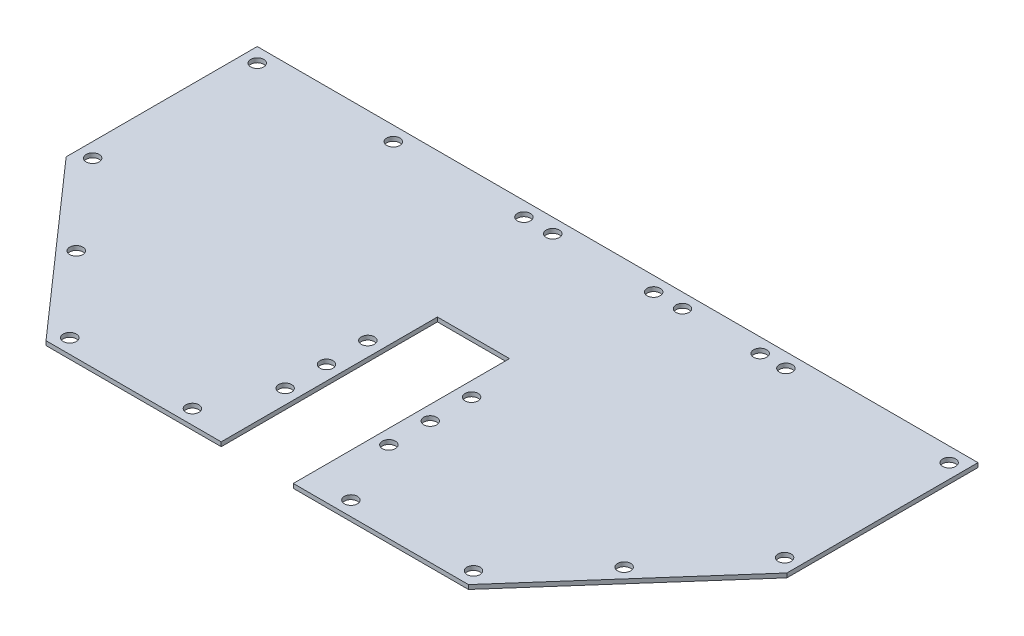
ISO-10303-21;
HEADER;
FILE_DESCRIPTION(('STEP AP214'),'2;1');
FILE_NAME('part.step','',(''),(''),'','','');
FILE_SCHEMA(('AUTOMOTIVE_DESIGN { 1 0 10303 214 1 1 1 1 }'));
ENDSEC;
DATA;
#1=APPLICATION_CONTEXT('core data for automotive mechanical design processes');
#2=APPLICATION_PROTOCOL_DEFINITION('international standard','automotive_design',2000,#1);
#3=PRODUCT_CONTEXT('',#1,'mechanical');
#4=PRODUCT('Part','Part','',(#3));
#5=PRODUCT_RELATED_PRODUCT_CATEGORY('part','',(#4));
#6=PRODUCT_DEFINITION_FORMATION('','',#4);
#7=PRODUCT_DEFINITION_CONTEXT('part definition',#1,'design');
#8=PRODUCT_DEFINITION('design','',#6,#7);
#9=PRODUCT_DEFINITION_SHAPE('','',#8);
#10=(LENGTH_UNIT() NAMED_UNIT(*) SI_UNIT(.MILLI.,.METRE.));
#11=(NAMED_UNIT(*) PLANE_ANGLE_UNIT() SI_UNIT($,.RADIAN.));
#12=(NAMED_UNIT(*) SI_UNIT($,.STERADIAN.) SOLID_ANGLE_UNIT());
#13=UNCERTAINTY_MEASURE_WITH_UNIT(LENGTH_MEASURE(1.E-05),#10,'distance_accuracy_value','');
#14=(GEOMETRIC_REPRESENTATION_CONTEXT(3) GLOBAL_UNCERTAINTY_ASSIGNED_CONTEXT((#13)) GLOBAL_UNIT_ASSIGNED_CONTEXT((#10,
#11,#12)) REPRESENTATION_CONTEXT('',''));
#15=CARTESIAN_POINT('',(0.,0.,0.));
#16=DIRECTION('',(0.,0.,1.));
#17=DIRECTION('',(1.,0.,0.));
#18=AXIS2_PLACEMENT_3D('',#15,#16,#17);
#19=CARTESIAN_POINT('',(139.7,1.5,0.));
#20=DIRECTION('',(-1.,0.,0.));
#21=DIRECTION('',(0.,0.,1.));
#22=AXIS2_PLACEMENT_3D('',#19,#20,#21);
#23=PLANE('',#22);
#24=DIRECTION('',(0.,0.,-1.));
#25=VECTOR('',#24,1.);
#26=CARTESIAN_POINT('',(139.7,0.,0.));
#27=LINE('',#26,#25);
#28=CARTESIAN_POINT('',(139.7,0.,126.995854643066));
#29=VERTEX_POINT('',#28);
#30=CARTESIAN_POINT('',(139.7,0.,50.8));
#31=VERTEX_POINT('',#30);
#32=EDGE_CURVE('E174',#29,#31,#27,.T.);
#33=ORIENTED_EDGE('',*,*,#32,.F.);
#34=DIRECTION('',(0.,-1.,0.));
#35=VECTOR('',#34,1.);
#36=CARTESIAN_POINT('',(139.7,1.5,126.995854643066));
#37=LINE('',#36,#35);
#38=CARTESIAN_POINT('',(139.7,1.5,126.995854643066));
#39=VERTEX_POINT('',#38);
#40=EDGE_CURVE('E11',#39,#29,#37,.T.);
#41=ORIENTED_EDGE('',*,*,#40,.F.);
#42=DIRECTION('',(0.,0.,-1.));
#43=VECTOR('',#42,1.);
#44=CARTESIAN_POINT('',(139.7,1.5,0.));
#45=LINE('',#44,#43);
#46=CARTESIAN_POINT('',(139.7,1.5,50.8));
#47=VERTEX_POINT('',#46);
#48=EDGE_CURVE('E645',#39,#47,#45,.T.);
#49=ORIENTED_EDGE('',*,*,#48,.T.);
#50=DIRECTION('',(0.,-1.,0.));
#51=VECTOR('',#50,1.);
#52=CARTESIAN_POINT('',(139.7,1.5,50.8));
#53=LINE('',#52,#51);
#54=EDGE_CURVE('E97',#47,#31,#53,.T.);
#55=ORIENTED_EDGE('',*,*,#54,.T.);
#56=EDGE_LOOP('',(#33,#41,#49,#55));
#57=FACE_BOUND('',#56,.T.);
#58=ADVANCED_FACE('F40',(#57),#23,.T.);
#59=CARTESIAN_POINT('',(0.,1.5,126.995854643066));
#60=DIRECTION('',(0.,0.,-1.));
#61=DIRECTION('',(-1.,0.,0.));
#62=AXIS2_PLACEMENT_3D('',#59,#60,#61);
#63=PLANE('',#62);
#64=DIRECTION('',(1.,0.,0.));
#65=VECTOR('',#64,1.);
#66=CARTESIAN_POINT('',(0.,0.,126.995854643066));
#67=LINE('',#66,#65);
#68=CARTESIAN_POINT('',(201.436197447224,0.,126.995854643066));
#69=VERTEX_POINT('',#68);
#70=EDGE_CURVE('E172',#29,#69,#67,.T.);
#71=ORIENTED_EDGE('',*,*,#70,.T.);
#72=DIRECTION('',(0.,-1.,0.));
#73=VECTOR('',#72,1.);
#74=CARTESIAN_POINT('',(201.436197447224,1.5,126.995854643066));
#75=LINE('',#74,#73);
#76=CARTESIAN_POINT('',(201.436197447224,1.5,126.995854643066));
#77=VERTEX_POINT('',#76);
#78=EDGE_CURVE('E49',#77,#69,#75,.T.);
#79=ORIENTED_EDGE('',*,*,#78,.F.);
#80=DIRECTION('',(1.,0.,0.));
#81=VECTOR('',#80,1.);
#82=CARTESIAN_POINT('',(0.,1.5,126.995854643066));
#83=LINE('',#82,#81);
#84=EDGE_CURVE('E641',#39,#77,#83,.T.);
#85=ORIENTED_EDGE('',*,*,#84,.F.);
#86=ORIENTED_EDGE('',*,*,#40,.T.);
#87=EDGE_LOOP('',(#71,#79,#85,#86));
#88=FACE_BOUND('',#87,.T.);
#89=ADVANCED_FACE('F173',(#88),#63,.F.);
#90=CARTESIAN_POINT('',(176.390536682891,1.5,155.420744499473));
#91=DIRECTION('',(0.750297634943516,0.,0.661100188321079));
#92=DIRECTION('',(0.661100188321079,0.,-0.750297634943516));
#93=AXIS2_PLACEMENT_3D('',#90,#91,#92);
#94=PLANE('',#93);
#95=DIRECTION('',(-0.661100188321079,0.,0.750297634943516));
#96=VECTOR('',#95,1.);
#97=CARTESIAN_POINT('',(176.390536682891,0.,155.420744499473));
#98=LINE('',#97,#96);
#99=CARTESIAN_POINT('',(254.,0.,67.34));
#100=VERTEX_POINT('',#99);
#101=EDGE_CURVE('E166',#100,#69,#98,.T.);
#102=ORIENTED_EDGE('',*,*,#101,.F.);
#103=DIRECTION('',(0.,-1.,0.));
#104=VECTOR('',#103,1.);
#105=CARTESIAN_POINT('',(254.,1.5,67.34));
#106=LINE('',#105,#104);
#107=CARTESIAN_POINT('',(254.,1.5,67.34));
#108=VERTEX_POINT('',#107);
#109=EDGE_CURVE('E158',#108,#100,#106,.T.);
#110=ORIENTED_EDGE('',*,*,#109,.F.);
#111=DIRECTION('',(-0.661100188321079,0.,0.750297634943516));
#112=VECTOR('',#111,1.);
#113=CARTESIAN_POINT('',(176.390536682891,1.5,155.420744499473));
#114=LINE('',#113,#112);
#115=EDGE_CURVE('E169',#108,#77,#114,.T.);
#116=ORIENTED_EDGE('',*,*,#115,.T.);
#117=ORIENTED_EDGE('',*,*,#78,.T.);
#118=EDGE_LOOP('',(#102,#110,#116,#117));
#119=FACE_BOUND('',#118,.T.);
#120=ADVANCED_FACE('F164',(#119),#94,.T.);
#121=CARTESIAN_POINT('',(254.,1.5,0.));
#122=DIRECTION('',(1.,0.,0.));
#123=DIRECTION('',(0.,0.,-1.));
#124=AXIS2_PLACEMENT_3D('',#121,#122,#123);
#125=PLANE('',#124);
#126=DIRECTION('',(0.,0.,1.));
#127=VECTOR('',#126,1.);
#128=CARTESIAN_POINT('',(254.,0.,0.));
#129=LINE('',#128,#127);
#130=CARTESIAN_POINT('',(254.,0.,0.));
#131=VERTEX_POINT('',#130);
#132=EDGE_CURVE('E180',#131,#100,#129,.T.);
#133=ORIENTED_EDGE('',*,*,#132,.F.);
#134=DIRECTION('',(0.,-1.,0.));
#135=VECTOR('',#134,1.);
#136=CARTESIAN_POINT('',(254.,1.5,0.));
#137=LINE('',#136,#135);
#138=CARTESIAN_POINT('',(254.,1.5,0.));
#139=VERTEX_POINT('',#138);
#140=EDGE_CURVE('E156',#139,#131,#137,.T.);
#141=ORIENTED_EDGE('',*,*,#140,.F.);
#142=DIRECTION('',(0.,0.,1.));
#143=VECTOR('',#142,1.);
#144=CARTESIAN_POINT('',(254.,1.5,0.));
#145=LINE('',#144,#143);
#146=EDGE_CURVE('E639',#139,#108,#145,.T.);
#147=ORIENTED_EDGE('',*,*,#146,.T.);
#148=ORIENTED_EDGE('',*,*,#109,.T.);
#149=EDGE_LOOP('',(#133,#141,#147,#148));
#150=FACE_BOUND('',#149,.T.);
#151=ADVANCED_FACE('F427',(#150),#125,.T.);
#152=CARTESIAN_POINT('',(0.,1.5,0.));
#153=DIRECTION('',(0.,0.,1.));
#154=DIRECTION('',(1.,0.,0.));
#155=AXIS2_PLACEMENT_3D('',#152,#153,#154);
#156=PLANE('',#155);
#157=DIRECTION('',(-1.,0.,0.));
#158=VECTOR('',#157,1.);
#159=CARTESIAN_POINT('',(0.,0.,0.));
#160=LINE('',#159,#158);
#161=CARTESIAN_POINT('',(0.,0.,0.));
#162=VERTEX_POINT('',#161);
#163=EDGE_CURVE('E182',#131,#162,#160,.T.);
#164=ORIENTED_EDGE('',*,*,#163,.T.);
#165=DIRECTION('',(0.,-1.,0.));
#166=VECTOR('',#165,1.);
#167=CARTESIAN_POINT('',(0.,1.5,0.));
#168=LINE('',#167,#166);
#169=CARTESIAN_POINT('',(0.,1.5,0.));
#170=VERTEX_POINT('',#169);
#171=EDGE_CURVE('E153',#170,#162,#168,.T.);
#172=ORIENTED_EDGE('',*,*,#171,.F.);
#173=DIRECTION('',(-1.,0.,0.));
#174=VECTOR('',#173,1.);
#175=CARTESIAN_POINT('',(0.,1.5,0.));
#176=LINE('',#175,#174);
#177=EDGE_CURVE('E643',#139,#170,#176,.T.);
#178=ORIENTED_EDGE('',*,*,#177,.F.);
#179=ORIENTED_EDGE('',*,*,#140,.T.);
#180=EDGE_LOOP('',(#164,#172,#178,#179));
#181=FACE_BOUND('',#180,.T.);
#182=ADVANCED_FACE('F423',(#181),#156,.F.);
#183=CARTESIAN_POINT('',(0.,1.5,0.));
#184=DIRECTION('',(1.,0.,0.));
#185=DIRECTION('',(0.,0.,-1.));
#186=AXIS2_PLACEMENT_3D('',#183,#184,#185);
#187=PLANE('',#186);
#188=DIRECTION('',(0.,0.,1.));
#189=VECTOR('',#188,1.);
#190=CARTESIAN_POINT('',(0.,0.,0.));
#191=LINE('',#190,#189);
#192=CARTESIAN_POINT('',(0.,0.,67.34));
#193=VERTEX_POINT('',#192);
#194=EDGE_CURVE('E188',#162,#193,#191,.T.);
#195=ORIENTED_EDGE('',*,*,#194,.T.);
#196=DIRECTION('',(0.,-1.,0.));
#197=VECTOR('',#196,1.);
#198=CARTESIAN_POINT('',(0.,1.5,67.34));
#199=LINE('',#198,#197);
#200=CARTESIAN_POINT('',(0.,1.5,67.34));
#201=VERTEX_POINT('',#200);
#202=EDGE_CURVE('E146',#201,#193,#199,.T.);
#203=ORIENTED_EDGE('',*,*,#202,.F.);
#204=DIRECTION('',(0.,0.,1.));
#205=VECTOR('',#204,1.);
#206=CARTESIAN_POINT('',(0.,1.5,0.));
#207=LINE('',#206,#205);
#208=EDGE_CURVE('E650',#170,#201,#207,.T.);
#209=ORIENTED_EDGE('',*,*,#208,.F.);
#210=ORIENTED_EDGE('',*,*,#171,.T.);
#211=EDGE_LOOP('',(#195,#203,#209,#210));
#212=FACE_BOUND('',#211,.T.);
#213=ADVANCED_FACE('F419',(#212),#187,.F.);
#214=CARTESIAN_POINT('',(-33.4015185356888,1.5,29.4264802922528));
#215=DIRECTION('',(0.750344141495339,0.,-0.661047403234914));
#216=DIRECTION('',(-0.661047403234914,0.,-0.750344141495339));
#217=AXIS2_PLACEMENT_3D('',#214,#215,#216);
#218=PLANE('',#217);
#219=DIRECTION('',(0.661047403234914,0.,0.750344141495339));
#220=VECTOR('',#219,1.);
#221=CARTESIAN_POINT('',(-33.4015185356888,0.,29.4264802922528));
#222=LINE('',#221,#220);
#223=CARTESIAN_POINT('',(52.5563479725036,0.,126.995854643066));
#224=VERTEX_POINT('',#223);
#225=EDGE_CURVE('E191',#193,#224,#222,.T.);
#226=ORIENTED_EDGE('',*,*,#225,.T.);
#227=DIRECTION('',(0.,-1.,0.));
#228=VECTOR('',#227,1.);
#229=CARTESIAN_POINT('',(52.5563479725036,1.5,126.995854643066));
#230=LINE('',#229,#228);
#231=CARTESIAN_POINT('',(52.5563479725036,1.5,126.995854643066));
#232=VERTEX_POINT('',#231);
#233=EDGE_CURVE('E144',#232,#224,#230,.T.);
#234=ORIENTED_EDGE('',*,*,#233,.F.);
#235=DIRECTION('',(0.661047403234914,0.,0.750344141495339));
#236=VECTOR('',#235,1.);
#237=CARTESIAN_POINT('',(-33.4015185356888,1.5,29.4264802922528));
#238=LINE('',#237,#236);
#239=EDGE_CURVE('E137',#201,#232,#238,.T.);
#240=ORIENTED_EDGE('',*,*,#239,.F.);
#241=ORIENTED_EDGE('',*,*,#202,.T.);
#242=EDGE_LOOP('',(#226,#234,#240,#241));
#243=FACE_BOUND('',#242,.T.);
#244=ADVANCED_FACE('F416',(#243),#218,.F.);
#245=CARTESIAN_POINT('',(0.,1.5,126.995854643066));
#246=DIRECTION('',(0.,0.,-1.));
#247=DIRECTION('',(-1.,0.,0.));
#248=AXIS2_PLACEMENT_3D('',#245,#246,#247);
#249=PLANE('',#248);
#250=DIRECTION('',(1.,0.,0.));
#251=VECTOR('',#250,1.);
#252=CARTESIAN_POINT('',(0.,0.,126.995854643066));
#253=LINE('',#252,#251);
#254=CARTESIAN_POINT('',(114.3,0.,126.995854643066));
#255=VERTEX_POINT('',#254);
#256=EDGE_CURVE('E143',#224,#255,#253,.T.);
#257=ORIENTED_EDGE('',*,*,#256,.T.);
#258=DIRECTION('',(0.,-1.,0.));
#259=VECTOR('',#258,1.);
#260=CARTESIAN_POINT('',(114.3,1.5,126.995854643066));
#261=LINE('',#260,#259);
#262=CARTESIAN_POINT('',(114.3,1.5,126.995854643066));
#263=VERTEX_POINT('',#262);
#264=EDGE_CURVE('E128',#263,#255,#261,.T.);
#265=ORIENTED_EDGE('',*,*,#264,.F.);
#266=DIRECTION('',(1.,0.,0.));
#267=VECTOR('',#266,1.);
#268=CARTESIAN_POINT('',(0.,1.5,126.995854643066));
#269=LINE('',#268,#267);
#270=EDGE_CURVE('E131',#232,#263,#269,.T.);
#271=ORIENTED_EDGE('',*,*,#270,.F.);
#272=ORIENTED_EDGE('',*,*,#233,.T.);
#273=EDGE_LOOP('',(#257,#265,#271,#272));
#274=FACE_BOUND('',#273,.T.);
#275=ADVANCED_FACE('F142',(#274),#249,.F.);
#276=CARTESIAN_POINT('',(114.3,1.5,0.));
#277=DIRECTION('',(-1.,0.,0.));
#278=DIRECTION('',(0.,0.,1.));
#279=AXIS2_PLACEMENT_3D('',#276,#277,#278);
#280=PLANE('',#279);
#281=DIRECTION('',(0.,0.,-1.));
#282=VECTOR('',#281,1.);
#283=CARTESIAN_POINT('',(114.3,0.,0.));
#284=LINE('',#283,#282);
#285=CARTESIAN_POINT('',(114.3,0.,50.8));
#286=VERTEX_POINT('',#285);
#287=EDGE_CURVE('E195',#255,#286,#284,.T.);
#288=ORIENTED_EDGE('',*,*,#287,.T.);
#289=DIRECTION('',(0.,-1.,0.));
#290=VECTOR('',#289,1.);
#291=CARTESIAN_POINT('',(114.3,1.5,50.8));
#292=LINE('',#291,#290);
#293=CARTESIAN_POINT('',(114.3,1.5,50.8));
#294=VERTEX_POINT('',#293);
#295=EDGE_CURVE('E130',#294,#286,#292,.T.);
#296=ORIENTED_EDGE('',*,*,#295,.F.);
#297=DIRECTION('',(0.,0.,-1.));
#298=VECTOR('',#297,1.);
#299=CARTESIAN_POINT('',(114.3,1.5,0.));
#300=LINE('',#299,#298);
#301=EDGE_CURVE('E123',#263,#294,#300,.T.);
#302=ORIENTED_EDGE('',*,*,#301,.F.);
#303=ORIENTED_EDGE('',*,*,#264,.T.);
#304=EDGE_LOOP('',(#288,#296,#302,#303));
#305=FACE_BOUND('',#304,.T.);
#306=ADVANCED_FACE('F126',(#305),#280,.F.);
#307=CARTESIAN_POINT('',(109.22,1.5,70.2458546430663));
#308=DIRECTION('',(0.,-1.,0.));
#309=DIRECTION('',(0.,0.,-1.));
#310=AXIS2_PLACEMENT_3D('',#307,#308,#309);
#311=CYLINDRICAL_SURFACE('',#310,2.30000000000001);
#312=CARTESIAN_POINT('',(109.22,1.5,70.2458546430663));
#313=DIRECTION('',(0.,1.,0.));
#314=DIRECTION('',(0.,0.,1.));
#315=AXIS2_PLACEMENT_3D('',#312,#313,#314);
#316=CIRCLE('',#315,2.30000000000001);
#317=CARTESIAN_POINT('',(109.22,1.5,72.5458546430663));
#318=VERTEX_POINT('',#317);
#319=EDGE_CURVE('E245',#318,#318,#316,.F.);
#320=ORIENTED_EDGE('',*,*,#319,.F.);
#321=EDGE_LOOP('',(#320));
#322=FACE_BOUND('',#321,.T.);
#323=CARTESIAN_POINT('',(109.22,0.,70.2458546430663));
#324=DIRECTION('',(0.,1.,0.));
#325=DIRECTION('',(0.,0.,1.));
#326=AXIS2_PLACEMENT_3D('',#323,#324,#325);
#327=CIRCLE('',#326,2.30000000000001);
#328=CARTESIAN_POINT('',(109.22,0.,72.5458546430663));
#329=VERTEX_POINT('',#328);
#330=EDGE_CURVE('E237',#329,#329,#327,.F.);
#331=ORIENTED_EDGE('',*,*,#330,.T.);
#332=EDGE_LOOP('',(#331));
#333=FACE_BOUND('',#332,.T.);
#334=ADVANCED_FACE('F353',(#322,#333),#311,.F.);
#335=CARTESIAN_POINT('',(144.78,1.5,83.8158546430663));
#336=DIRECTION('',(0.,-1.,0.));
#337=DIRECTION('',(0.,0.,-1.));
#338=AXIS2_PLACEMENT_3D('',#335,#336,#337);
#339=CYLINDRICAL_SURFACE('',#338,2.30000000000001);
#340=CARTESIAN_POINT('',(144.78,1.5,83.8158546430663));
#341=DIRECTION('',(0.,1.,0.));
#342=DIRECTION('',(0.,0.,1.));
#343=AXIS2_PLACEMENT_3D('',#340,#341,#342);
#344=CIRCLE('',#343,2.30000000000001);
#345=CARTESIAN_POINT('',(144.78,1.5,86.1158546430663));
#346=VERTEX_POINT('',#345);
#347=EDGE_CURVE('E250',#346,#346,#344,.F.);
#348=ORIENTED_EDGE('',*,*,#347,.F.);
#349=EDGE_LOOP('',(#348));
#350=FACE_BOUND('',#349,.T.);
#351=CARTESIAN_POINT('',(144.78,0.,83.8158546430663));
#352=DIRECTION('',(0.,1.,0.));
#353=DIRECTION('',(0.,0.,1.));
#354=AXIS2_PLACEMENT_3D('',#351,#352,#353);
#355=CIRCLE('',#354,2.30000000000001);
#356=CARTESIAN_POINT('',(144.78,0.,86.1158546430663));
#357=VERTEX_POINT('',#356);
#358=EDGE_CURVE('E234',#357,#357,#355,.F.);
#359=ORIENTED_EDGE('',*,*,#358,.T.);
#360=EDGE_LOOP('',(#359));
#361=FACE_BOUND('',#360,.T.);
#362=ADVANCED_FACE('F356',(#350,#361),#339,.F.);
#363=CARTESIAN_POINT('',(223.528114704509,1.5,94.2390748809774));
#364=DIRECTION('',(0.,-1.,0.));
#365=DIRECTION('',(0.,0.,-1.));
#366=AXIS2_PLACEMENT_3D('',#363,#364,#365);
#367=CYLINDRICAL_SURFACE('',#366,2.30000000000001);
#368=CARTESIAN_POINT('',(223.528114704509,1.5,94.2390748809774));
#369=DIRECTION('',(0.,1.,0.));
#370=DIRECTION('',(0.,0.,1.));
#371=AXIS2_PLACEMENT_3D('',#368,#369,#370);
#372=CIRCLE('',#371,2.30000000000001);
#373=CARTESIAN_POINT('',(223.528114704509,1.5,96.5390748809774));
#374=VERTEX_POINT('',#373);
#375=EDGE_CURVE('E687',#374,#374,#372,.F.);
#376=ORIENTED_EDGE('',*,*,#375,.F.);
#377=EDGE_LOOP('',(#376));
#378=FACE_BOUND('',#377,.T.);
#379=CARTESIAN_POINT('',(223.528114704509,0.,94.2390748809774));
#380=DIRECTION('',(0.,1.,0.));
#381=DIRECTION('',(0.,0.,1.));
#382=AXIS2_PLACEMENT_3D('',#379,#380,#381);
#383=CIRCLE('',#382,2.30000000000001);
#384=CARTESIAN_POINT('',(223.528114704509,0.,96.5390748809774));
#385=VERTEX_POINT('',#384);
#386=EDGE_CURVE('E231',#385,#385,#383,.F.);
#387=ORIENTED_EDGE('',*,*,#386,.T.);
#388=EDGE_LOOP('',(#387));
#389=FACE_BOUND('',#388,.T.);
#390=ADVANCED_FACE('F360',(#378,#389),#367,.F.);
#391=CARTESIAN_POINT('',(154.94,1.5,5.08000000000003));
#392=DIRECTION('',(0.,-1.,0.));
#393=DIRECTION('',(0.,0.,-1.));
#394=AXIS2_PLACEMENT_3D('',#391,#392,#393);
#395=CYLINDRICAL_SURFACE('',#394,2.30000000000001);
#396=CARTESIAN_POINT('',(154.94,1.5,5.08000000000003));
#397=DIRECTION('',(0.,1.,0.));
#398=DIRECTION('',(0.,0.,1.));
#399=AXIS2_PLACEMENT_3D('',#396,#397,#398);
#400=CIRCLE('',#399,2.30000000000001);
#401=CARTESIAN_POINT('',(154.94,1.5,7.38000000000003));
#402=VERTEX_POINT('',#401);
#403=EDGE_CURVE('E684',#402,#402,#400,.F.);
#404=ORIENTED_EDGE('',*,*,#403,.F.);
#405=EDGE_LOOP('',(#404));
#406=FACE_BOUND('',#405,.T.);
#407=CARTESIAN_POINT('',(154.94,0.,5.08000000000003));
#408=DIRECTION('',(0.,1.,0.));
#409=DIRECTION('',(0.,0.,1.));
#410=AXIS2_PLACEMENT_3D('',#407,#408,#409);
#411=CIRCLE('',#410,2.30000000000001);
#412=CARTESIAN_POINT('',(154.94,0.,7.38000000000003));
#413=VERTEX_POINT('',#412);
#414=EDGE_CURVE('E228',#413,#413,#411,.F.);
#415=ORIENTED_EDGE('',*,*,#414,.T.);
#416=EDGE_LOOP('',(#415));
#417=FACE_BOUND('',#416,.T.);
#418=ADVANCED_FACE('F364',(#406,#417),#395,.F.);
#419=CARTESIAN_POINT('',(109.22,1.5,5.08000000000003));
#420=DIRECTION('',(0.,-1.,0.));
#421=DIRECTION('',(0.,0.,-1.));
#422=AXIS2_PLACEMENT_3D('',#419,#420,#421);
#423=CYLINDRICAL_SURFACE('',#422,2.29999999999999);
#424=CARTESIAN_POINT('',(109.22,1.5,5.08000000000003));
#425=DIRECTION('',(0.,1.,0.));
#426=DIRECTION('',(0.,0.,1.));
#427=AXIS2_PLACEMENT_3D('',#424,#425,#426);
#428=CIRCLE('',#427,2.29999999999999);
#429=CARTESIAN_POINT('',(109.22,1.5,7.38000000000002));
#430=VERTEX_POINT('',#429);
#431=EDGE_CURVE('E681',#430,#430,#428,.T.);
#432=ORIENTED_EDGE('',*,*,#431,.T.);
#433=EDGE_LOOP('',(#432));
#434=FACE_BOUND('',#433,.T.);
#435=CARTESIAN_POINT('',(109.22,0.,5.08000000000003));
#436=DIRECTION('',(0.,1.,0.));
#437=DIRECTION('',(0.,0.,1.));
#438=AXIS2_PLACEMENT_3D('',#435,#436,#437);
#439=CIRCLE('',#438,2.29999999999999);
#440=CARTESIAN_POINT('',(109.22,0.,7.38000000000002));
#441=VERTEX_POINT('',#440);
#442=EDGE_CURVE('E225',#441,#441,#439,.T.);
#443=ORIENTED_EDGE('',*,*,#442,.F.);
#444=EDGE_LOOP('',(#443));
#445=FACE_BOUND('',#444,.T.);
#446=ADVANCED_FACE('F368',(#434,#445),#423,.F.);
#447=CARTESIAN_POINT('',(154.926197447224,1.5,121.915854643066));
#448=DIRECTION('',(0.,-1.,0.));
#449=DIRECTION('',(0.,0.,-1.));
#450=AXIS2_PLACEMENT_3D('',#447,#448,#449);
#451=CYLINDRICAL_SURFACE('',#450,2.30000000000001);
#452=CARTESIAN_POINT('',(154.926197447224,1.5,121.915854643066));
#453=DIRECTION('',(0.,1.,0.));
#454=DIRECTION('',(0.,0.,1.));
#455=AXIS2_PLACEMENT_3D('',#452,#453,#454);
#456=CIRCLE('',#455,2.30000000000001);
#457=CARTESIAN_POINT('',(154.926197447224,1.5,124.215854643066));
#458=VERTEX_POINT('',#457);
#459=EDGE_CURVE('E678',#458,#458,#456,.F.);
#460=ORIENTED_EDGE('',*,*,#459,.F.);
#461=EDGE_LOOP('',(#460));
#462=FACE_BOUND('',#461,.T.);
#463=CARTESIAN_POINT('',(154.926197447224,0.,121.915854643066));
#464=DIRECTION('',(0.,1.,0.));
#465=DIRECTION('',(0.,0.,1.));
#466=AXIS2_PLACEMENT_3D('',#463,#464,#465);
#467=CIRCLE('',#466,2.30000000000001);
#468=CARTESIAN_POINT('',(154.926197447224,0.,124.215854643066));
#469=VERTEX_POINT('',#468);
#470=EDGE_CURVE('E222',#469,#469,#467,.F.);
#471=ORIENTED_EDGE('',*,*,#470,.T.);
#472=EDGE_LOOP('',(#471));
#473=FACE_BOUND('',#472,.T.);
#474=ADVANCED_FACE('F372',(#462,#473),#451,.F.);
#475=CARTESIAN_POINT('',(248.92,1.5,63.0864143021339));
#476=DIRECTION('',(0.,-1.,0.));
#477=DIRECTION('',(0.,0.,-1.));
#478=AXIS2_PLACEMENT_3D('',#475,#476,#477);
#479=CYLINDRICAL_SURFACE('',#478,2.30000000000001);
#480=CARTESIAN_POINT('',(248.92,1.5,63.0864143021339));
#481=DIRECTION('',(0.,1.,0.));
#482=DIRECTION('',(0.,0.,1.));
#483=AXIS2_PLACEMENT_3D('',#480,#481,#482);
#484=CIRCLE('',#483,2.30000000000001);
#485=CARTESIAN_POINT('',(248.92,1.5,65.3864143021339));
#486=VERTEX_POINT('',#485);
#487=EDGE_CURVE('E675',#486,#486,#484,.F.);
#488=ORIENTED_EDGE('',*,*,#487,.F.);
#489=EDGE_LOOP('',(#488));
#490=FACE_BOUND('',#489,.T.);
#491=CARTESIAN_POINT('',(248.92,0.,63.0864143021339));
#492=DIRECTION('',(0.,1.,0.));
#493=DIRECTION('',(0.,0.,1.));
#494=AXIS2_PLACEMENT_3D('',#491,#492,#493);
#495=CIRCLE('',#494,2.30000000000001);
#496=CARTESIAN_POINT('',(248.92,0.,65.3864143021339));
#497=VERTEX_POINT('',#496);
#498=EDGE_CURVE('E219',#497,#497,#495,.F.);
#499=ORIENTED_EDGE('',*,*,#498,.T.);
#500=EDGE_LOOP('',(#499));
#501=FACE_BOUND('',#500,.T.);
#502=ADVANCED_FACE('F376',(#490,#501),#479,.F.);
#503=CARTESIAN_POINT('',(182.3,1.5,5.08000000000003));
#504=DIRECTION('',(0.,-1.,0.));
#505=DIRECTION('',(0.,0.,-1.));
#506=AXIS2_PLACEMENT_3D('',#503,#504,#505);
#507=CYLINDRICAL_SURFACE('',#506,2.30000000000001);
#508=CARTESIAN_POINT('',(182.3,1.5,5.08000000000003));
#509=DIRECTION('',(0.,1.,0.));
#510=DIRECTION('',(0.,0.,1.));
#511=AXIS2_PLACEMENT_3D('',#508,#509,#510);
#512=CIRCLE('',#511,2.30000000000001);
#513=CARTESIAN_POINT('',(182.3,1.5,7.38000000000003));
#514=VERTEX_POINT('',#513);
#515=EDGE_CURVE('E672',#514,#514,#512,.F.);
#516=ORIENTED_EDGE('',*,*,#515,.F.);
#517=EDGE_LOOP('',(#516));
#518=FACE_BOUND('',#517,.T.);
#519=CARTESIAN_POINT('',(182.3,0.,5.08000000000003));
#520=DIRECTION('',(0.,1.,0.));
#521=DIRECTION('',(0.,0.,1.));
#522=AXIS2_PLACEMENT_3D('',#519,#520,#521);
#523=CIRCLE('',#522,2.30000000000001);
#524=CARTESIAN_POINT('',(182.3,0.,7.38000000000003));
#525=VERTEX_POINT('',#524);
#526=EDGE_CURVE('E216',#525,#525,#523,.F.);
#527=ORIENTED_EDGE('',*,*,#526,.T.);
#528=EDGE_LOOP('',(#527));
#529=FACE_BOUND('',#528,.T.);
#530=ADVANCED_FACE('F380',(#518,#529),#507,.F.);
#531=CARTESIAN_POINT('',(55.8561974472237,1.5,121.915854643066));
#532=DIRECTION('',(0.,-1.,0.));
#533=DIRECTION('',(0.,0.,-1.));
#534=AXIS2_PLACEMENT_3D('',#531,#532,#533);
#535=CYLINDRICAL_SURFACE('',#534,2.30000000000001);
#536=CARTESIAN_POINT('',(55.8561974472237,1.5,121.915854643066));
#537=DIRECTION('',(0.,1.,0.));
#538=DIRECTION('',(0.,0.,1.));
#539=AXIS2_PLACEMENT_3D('',#536,#537,#538);
#540=CIRCLE('',#539,2.30000000000001);
#541=CARTESIAN_POINT('',(55.8561974472237,1.5,124.215854643066));
#542=VERTEX_POINT('',#541);
#543=EDGE_CURVE('E669',#542,#542,#540,.T.);
#544=ORIENTED_EDGE('',*,*,#543,.T.);
#545=EDGE_LOOP('',(#544));
#546=FACE_BOUND('',#545,.T.);
#547=CARTESIAN_POINT('',(55.8561974472237,0.,121.915854643066));
#548=DIRECTION('',(0.,1.,0.));
#549=DIRECTION('',(0.,0.,1.));
#550=AXIS2_PLACEMENT_3D('',#547,#548,#549);
#551=CIRCLE('',#550,2.30000000000001);
#552=CARTESIAN_POINT('',(55.8561974472237,0.,124.215854643066));
#553=VERTEX_POINT('',#552);
#554=EDGE_CURVE('E213',#553,#553,#551,.T.);
#555=ORIENTED_EDGE('',*,*,#554,.F.);
#556=EDGE_LOOP('',(#555));
#557=FACE_BOUND('',#556,.T.);
#558=ADVANCED_FACE('F384',(#546,#557),#535,.F.);
#559=CARTESIAN_POINT('',(99.0661974472237,1.5,121.915854643066));
#560=DIRECTION('',(0.,-1.,0.));
#561=DIRECTION('',(0.,0.,-1.));
#562=AXIS2_PLACEMENT_3D('',#559,#560,#561);
#563=CYLINDRICAL_SURFACE('',#562,2.29999999999999);
#564=CARTESIAN_POINT('',(99.0661974472237,1.5,121.915854643066));
#565=DIRECTION('',(0.,1.,0.));
#566=DIRECTION('',(0.,0.,1.));
#567=AXIS2_PLACEMENT_3D('',#564,#565,#566);
#568=CIRCLE('',#567,2.29999999999999);
#569=CARTESIAN_POINT('',(99.0661974472237,1.5,124.215854643066));
#570=VERTEX_POINT('',#569);
#571=EDGE_CURVE('E666',#570,#570,#568,.T.);
#572=ORIENTED_EDGE('',*,*,#571,.T.);
#573=EDGE_LOOP('',(#572));
#574=FACE_BOUND('',#573,.T.);
#575=CARTESIAN_POINT('',(99.0661974472237,0.,121.915854643066));
#576=DIRECTION('',(0.,1.,0.));
#577=DIRECTION('',(0.,0.,1.));
#578=AXIS2_PLACEMENT_3D('',#575,#576,#577);
#579=CIRCLE('',#578,2.29999999999999);
#580=CARTESIAN_POINT('',(99.0661974472237,0.,124.215854643066));
#581=VERTEX_POINT('',#580);
#582=EDGE_CURVE('E210',#581,#581,#579,.T.);
#583=ORIENTED_EDGE('',*,*,#582,.F.);
#584=EDGE_LOOP('',(#583));
#585=FACE_BOUND('',#584,.T.);
#586=ADVANCED_FACE('F388',(#574,#585),#563,.F.);
#587=CARTESIAN_POINT('',(5.08,1.5,63.08));
#588=DIRECTION('',(0.,-1.,0.));
#589=DIRECTION('',(0.,0.,-1.));
#590=AXIS2_PLACEMENT_3D('',#587,#588,#589);
#591=CYLINDRICAL_SURFACE('',#590,2.3);
#592=CARTESIAN_POINT('',(5.08,1.5,63.08));
#593=DIRECTION('',(0.,1.,0.));
#594=DIRECTION('',(0.,0.,1.));
#595=AXIS2_PLACEMENT_3D('',#592,#593,#594);
#596=CIRCLE('',#595,2.3);
#597=CARTESIAN_POINT('',(5.08,1.5,65.38));
#598=VERTEX_POINT('',#597);
#599=EDGE_CURVE('E663',#598,#598,#596,.T.);
#600=ORIENTED_EDGE('',*,*,#599,.T.);
#601=EDGE_LOOP('',(#600));
#602=FACE_BOUND('',#601,.T.);
#603=CARTESIAN_POINT('',(5.08,0.,63.08));
#604=DIRECTION('',(0.,1.,0.));
#605=DIRECTION('',(0.,0.,1.));
#606=AXIS2_PLACEMENT_3D('',#603,#604,#605);
#607=CIRCLE('',#606,2.3);
#608=CARTESIAN_POINT('',(5.08,0.,65.38));
#609=VERTEX_POINT('',#608);
#610=EDGE_CURVE('E207',#609,#609,#607,.T.);
#611=ORIENTED_EDGE('',*,*,#610,.F.);
#612=EDGE_LOOP('',(#611));
#613=FACE_BOUND('',#612,.T.);
#614=ADVANCED_FACE('F392',(#602,#613),#591,.F.);
#615=CARTESIAN_POINT('',(99.06,1.5,5.08000000000003));
#616=DIRECTION('',(0.,-1.,0.));
#617=DIRECTION('',(0.,0.,-1.));
#618=AXIS2_PLACEMENT_3D('',#615,#616,#617);
#619=CYLINDRICAL_SURFACE('',#618,2.29999999999999);
#620=CARTESIAN_POINT('',(99.06,1.5,5.08000000000003));
#621=DIRECTION('',(0.,1.,0.));
#622=DIRECTION('',(0.,0.,1.));
#623=AXIS2_PLACEMENT_3D('',#620,#621,#622);
#624=CIRCLE('',#623,2.29999999999999);
#625=CARTESIAN_POINT('',(99.06,1.5,7.38000000000002));
#626=VERTEX_POINT('',#625);
#627=EDGE_CURVE('E660',#626,#626,#624,.T.);
#628=ORIENTED_EDGE('',*,*,#627,.T.);
#629=EDGE_LOOP('',(#628));
#630=FACE_BOUND('',#629,.T.);
#631=CARTESIAN_POINT('',(99.06,0.,5.08000000000003));
#632=DIRECTION('',(0.,1.,0.));
#633=DIRECTION('',(0.,0.,1.));
#634=AXIS2_PLACEMENT_3D('',#631,#632,#633);
#635=CIRCLE('',#634,2.29999999999999);
#636=CARTESIAN_POINT('',(99.06,0.,7.38000000000002));
#637=VERTEX_POINT('',#636);
#638=EDGE_CURVE('E204',#637,#637,#635,.T.);
#639=ORIENTED_EDGE('',*,*,#638,.F.);
#640=EDGE_LOOP('',(#639));
#641=FACE_BOUND('',#640,.T.);
#642=ADVANCED_FACE('F396',(#630,#641),#619,.F.);
#643=CARTESIAN_POINT('',(53.03,1.5,5.08000000000003));
#644=DIRECTION('',(0.,-1.,0.));
#645=DIRECTION('',(0.,0.,-1.));
#646=AXIS2_PLACEMENT_3D('',#643,#644,#645);
#647=CYLINDRICAL_SURFACE('',#646,2.30000000000001);
#648=CARTESIAN_POINT('',(53.03,1.5,5.08000000000003));
#649=DIRECTION('',(0.,1.,0.));
#650=DIRECTION('',(0.,0.,1.));
#651=AXIS2_PLACEMENT_3D('',#648,#649,#650);
#652=CIRCLE('',#651,2.30000000000001);
#653=CARTESIAN_POINT('',(53.03,1.5,7.38000000000004));
#654=VERTEX_POINT('',#653);
#655=EDGE_CURVE('E657',#654,#654,#652,.T.);
#656=ORIENTED_EDGE('',*,*,#655,.T.);
#657=EDGE_LOOP('',(#656));
#658=FACE_BOUND('',#657,.T.);
#659=CARTESIAN_POINT('',(53.03,0.,5.08000000000003));
#660=DIRECTION('',(0.,1.,0.));
#661=DIRECTION('',(0.,0.,1.));
#662=AXIS2_PLACEMENT_3D('',#659,#660,#661);
#663=CIRCLE('',#662,2.30000000000001);
#664=CARTESIAN_POINT('',(53.03,0.,7.38000000000004));
#665=VERTEX_POINT('',#664);
#666=EDGE_CURVE('E201',#665,#665,#663,.T.);
#667=ORIENTED_EDGE('',*,*,#666,.F.);
#668=EDGE_LOOP('',(#667));
#669=FACE_BOUND('',#668,.T.);
#670=ADVANCED_FACE('F400',(#658,#669),#647,.F.);
#671=CARTESIAN_POINT('',(5.08,1.5,5.08000000000003));
#672=DIRECTION('',(0.,-1.,0.));
#673=DIRECTION('',(0.,0.,-1.));
#674=AXIS2_PLACEMENT_3D('',#671,#672,#673);
#675=CYLINDRICAL_SURFACE('',#674,2.3);
#676=CARTESIAN_POINT('',(5.08,1.5,5.08000000000003));
#677=DIRECTION('',(0.,1.,0.));
#678=DIRECTION('',(0.,0.,1.));
#679=AXIS2_PLACEMENT_3D('',#676,#677,#678);
#680=CIRCLE('',#679,2.3);
#681=CARTESIAN_POINT('',(5.08,1.5,7.38000000000003));
#682=VERTEX_POINT('',#681);
#683=EDGE_CURVE('E654',#682,#682,#680,.T.);
#684=ORIENTED_EDGE('',*,*,#683,.T.);
#685=EDGE_LOOP('',(#684));
#686=FACE_BOUND('',#685,.T.);
#687=CARTESIAN_POINT('',(5.08,0.,5.08000000000003));
#688=DIRECTION('',(0.,1.,0.));
#689=DIRECTION('',(0.,0.,1.));
#690=AXIS2_PLACEMENT_3D('',#687,#688,#689);
#691=CIRCLE('',#690,2.3);
#692=CARTESIAN_POINT('',(5.08,0.,7.38000000000003));
#693=VERTEX_POINT('',#692);
#694=EDGE_CURVE('E198',#693,#693,#691,.T.);
#695=ORIENTED_EDGE('',*,*,#694,.F.);
#696=EDGE_LOOP('',(#695));
#697=FACE_BOUND('',#696,.T.);
#698=ADVANCED_FACE('F404',(#686,#697),#675,.F.);
#699=CARTESIAN_POINT('',(0.,1.5,50.8));
#700=DIRECTION('',(0.,0.,-1.));
#701=DIRECTION('',(-1.,0.,0.));
#702=AXIS2_PLACEMENT_3D('',#699,#700,#701);
#703=PLANE('',#702);
#704=DIRECTION('',(1.,0.,0.));
#705=VECTOR('',#704,1.);
#706=CARTESIAN_POINT('',(0.,0.,50.8));
#707=LINE('',#706,#705);
#708=EDGE_CURVE('E90',#286,#31,#707,.T.);
#709=ORIENTED_EDGE('',*,*,#708,.T.);
#710=ORIENTED_EDGE('',*,*,#54,.F.);
#711=DIRECTION('',(1.,0.,0.));
#712=VECTOR('',#711,1.);
#713=CARTESIAN_POINT('',(0.,1.5,50.8));
#714=LINE('',#713,#712);
#715=EDGE_CURVE('E57',#294,#47,#714,.T.);
#716=ORIENTED_EDGE('',*,*,#715,.F.);
#717=ORIENTED_EDGE('',*,*,#295,.T.);
#718=EDGE_LOOP('',(#709,#710,#716,#717));
#719=FACE_BOUND('',#718,.T.);
#720=ADVANCED_FACE('F289',(#719),#703,.F.);
#721=CARTESIAN_POINT('',(248.919999642481,1.5,5.08641430213388));
#722=DIRECTION('',(0.,-1.,0.));
#723=DIRECTION('',(0.,0.,-1.));
#724=AXIS2_PLACEMENT_3D('',#721,#722,#723);
#725=CYLINDRICAL_SURFACE('',#724,2.30000000000006);
#726=CARTESIAN_POINT('',(248.919999642481,1.5,5.08641430213388));
#727=DIRECTION('',(0.,1.,0.));
#728=DIRECTION('',(0.,0.,1.));
#729=AXIS2_PLACEMENT_3D('',#726,#727,#728);
#730=CIRCLE('',#729,2.30000000000006);
#731=CARTESIAN_POINT('',(248.919999642481,1.5,7.38641430213395));
#732=VERTEX_POINT('',#731);
#733=EDGE_CURVE('E764',#732,#732,#730,.F.);
#734=ORIENTED_EDGE('',*,*,#733,.F.);
#735=EDGE_LOOP('',(#734));
#736=FACE_BOUND('',#735,.T.);
#737=CARTESIAN_POINT('',(248.919999642481,0.,5.08641430213388));
#738=DIRECTION('',(0.,1.,0.));
#739=DIRECTION('',(0.,0.,1.));
#740=AXIS2_PLACEMENT_3D('',#737,#738,#739);
#741=CIRCLE('',#740,2.30000000000006);
#742=CARTESIAN_POINT('',(248.919999642481,0.,7.38641430213395));
#743=VERTEX_POINT('',#742);
#744=EDGE_CURVE('E275',#743,#743,#741,.F.);
#745=ORIENTED_EDGE('',*,*,#744,.T.);
#746=EDGE_LOOP('',(#745));
#747=FACE_BOUND('',#746,.T.);
#748=ADVANCED_FACE('F285',(#736,#747),#725,.F.);
#749=CARTESIAN_POINT('',(198.136197447224,1.5,121.915854643066));
#750=DIRECTION('',(0.,-1.,0.));
#751=DIRECTION('',(0.,0.,-1.));
#752=AXIS2_PLACEMENT_3D('',#749,#750,#751);
#753=CYLINDRICAL_SURFACE('',#752,2.30000000000001);
#754=CARTESIAN_POINT('',(198.136197447224,1.5,121.915854643066));
#755=DIRECTION('',(0.,1.,0.));
#756=DIRECTION('',(0.,0.,1.));
#757=AXIS2_PLACEMENT_3D('',#754,#755,#756);
#758=CIRCLE('',#757,2.30000000000001);
#759=CARTESIAN_POINT('',(198.136197447224,1.5,124.215854643066));
#760=VERTEX_POINT('',#759);
#761=EDGE_CURVE('E767',#760,#760,#758,.F.);
#762=ORIENTED_EDGE('',*,*,#761,.F.);
#763=EDGE_LOOP('',(#762));
#764=FACE_BOUND('',#763,.T.);
#765=CARTESIAN_POINT('',(198.136197447224,0.,121.915854643066));
#766=DIRECTION('',(0.,1.,0.));
#767=DIRECTION('',(0.,0.,1.));
#768=AXIS2_PLACEMENT_3D('',#765,#766,#767);
#769=CIRCLE('',#768,2.30000000000001);
#770=CARTESIAN_POINT('',(198.136197447224,0.,124.215854643066));
#771=VERTEX_POINT('',#770);
#772=EDGE_CURVE('E272',#771,#771,#769,.F.);
#773=ORIENTED_EDGE('',*,*,#772,.T.);
#774=EDGE_LOOP('',(#773));
#775=FACE_BOUND('',#774,.T.);
#776=ADVANCED_FACE('F288',(#764,#775),#753,.F.);
#777=CARTESIAN_POINT('',(144.78,1.5,5.08000000000003));
#778=DIRECTION('',(0.,-1.,0.));
#779=DIRECTION('',(0.,0.,-1.));
#780=AXIS2_PLACEMENT_3D('',#777,#778,#779);
#781=CYLINDRICAL_SURFACE('',#780,2.30000000000001);
#782=CARTESIAN_POINT('',(144.78,1.5,5.08000000000003));
#783=DIRECTION('',(0.,1.,0.));
#784=DIRECTION('',(0.,0.,1.));
#785=AXIS2_PLACEMENT_3D('',#782,#783,#784);
#786=CIRCLE('',#785,2.30000000000001);
#787=CARTESIAN_POINT('',(144.78,1.5,7.38000000000003));
#788=VERTEX_POINT('',#787);
#789=EDGE_CURVE('E770',#788,#788,#786,.F.);
#790=ORIENTED_EDGE('',*,*,#789,.F.);
#791=EDGE_LOOP('',(#790));
#792=FACE_BOUND('',#791,.T.);
#793=CARTESIAN_POINT('',(144.78,0.,5.08000000000003));
#794=DIRECTION('',(0.,1.,0.));
#795=DIRECTION('',(0.,0.,1.));
#796=AXIS2_PLACEMENT_3D('',#793,#794,#795);
#797=CIRCLE('',#796,2.30000000000001);
#798=CARTESIAN_POINT('',(144.78,0.,7.38000000000003));
#799=VERTEX_POINT('',#798);
#800=EDGE_CURVE('E269',#799,#799,#797,.F.);
#801=ORIENTED_EDGE('',*,*,#800,.T.);
#802=EDGE_LOOP('',(#801));
#803=FACE_BOUND('',#802,.T.);
#804=ADVANCED_FACE('F293',(#792,#803),#781,.F.);
#805=CARTESIAN_POINT('',(191.38,1.5,5.08000000000003));
#806=DIRECTION('',(0.,-1.,0.));
#807=DIRECTION('',(0.,0.,-1.));
#808=AXIS2_PLACEMENT_3D('',#805,#806,#807);
#809=CYLINDRICAL_SURFACE('',#808,2.30000000000001);
#810=CARTESIAN_POINT('',(191.38,1.5,5.08000000000003));
#811=DIRECTION('',(0.,1.,0.));
#812=DIRECTION('',(0.,0.,1.));
#813=AXIS2_PLACEMENT_3D('',#810,#811,#812);
#814=CIRCLE('',#813,2.30000000000001);
#815=CARTESIAN_POINT('',(191.38,1.5,7.38000000000003));
#816=VERTEX_POINT('',#815);
#817=EDGE_CURVE('E773',#816,#816,#814,.F.);
#818=ORIENTED_EDGE('',*,*,#817,.F.);
#819=EDGE_LOOP('',(#818));
#820=FACE_BOUND('',#819,.T.);
#821=CARTESIAN_POINT('',(191.38,0.,5.08000000000003));
#822=DIRECTION('',(0.,1.,0.));
#823=DIRECTION('',(0.,0.,1.));
#824=AXIS2_PLACEMENT_3D('',#821,#822,#823);
#825=CIRCLE('',#824,2.30000000000001);
#826=CARTESIAN_POINT('',(191.38,0.,7.38000000000003));
#827=VERTEX_POINT('',#826);
#828=EDGE_CURVE('E266',#827,#827,#825,.F.);
#829=ORIENTED_EDGE('',*,*,#828,.T.);
#830=EDGE_LOOP('',(#829));
#831=FACE_BOUND('',#830,.T.);
#832=ADVANCED_FACE('F297',(#820,#831),#809,.F.);
#833=CARTESIAN_POINT('',(144.78,1.5,98.3858546430663));
#834=DIRECTION('',(0.,-1.,0.));
#835=DIRECTION('',(0.,0.,-1.));
#836=AXIS2_PLACEMENT_3D('',#833,#834,#835);
#837=CYLINDRICAL_SURFACE('',#836,2.30000000000001);
#838=CARTESIAN_POINT('',(144.78,1.5,98.3858546430663));
#839=DIRECTION('',(0.,1.,0.));
#840=DIRECTION('',(0.,0.,1.));
#841=AXIS2_PLACEMENT_3D('',#838,#839,#840);
#842=CIRCLE('',#841,2.30000000000001);
#843=CARTESIAN_POINT('',(144.78,1.5,100.685854643066));
#844=VERTEX_POINT('',#843);
#845=EDGE_CURVE('E776',#844,#844,#842,.F.);
#846=ORIENTED_EDGE('',*,*,#845,.F.);
#847=EDGE_LOOP('',(#846));
#848=FACE_BOUND('',#847,.T.);
#849=CARTESIAN_POINT('',(144.78,0.,98.3858546430663));
#850=DIRECTION('',(0.,1.,0.));
#851=DIRECTION('',(0.,0.,1.));
#852=AXIS2_PLACEMENT_3D('',#849,#850,#851);
#853=CIRCLE('',#852,2.30000000000001);
#854=CARTESIAN_POINT('',(144.78,0.,100.685854643066));
#855=VERTEX_POINT('',#854);
#856=EDGE_CURVE('E263',#855,#855,#853,.F.);
#857=ORIENTED_EDGE('',*,*,#856,.T.);
#858=EDGE_LOOP('',(#857));
#859=FACE_BOUND('',#858,.T.);
#860=ADVANCED_FACE('F301',(#848,#859),#837,.F.);
#861=CARTESIAN_POINT('',(144.78,1.5,69.2458546430663));
#862=DIRECTION('',(0.,-1.,0.));
#863=DIRECTION('',(0.,0.,-1.));
#864=AXIS2_PLACEMENT_3D('',#861,#862,#863);
#865=CYLINDRICAL_SURFACE('',#864,2.30000000000001);
#866=CARTESIAN_POINT('',(144.78,1.5,69.2458546430663));
#867=DIRECTION('',(0.,1.,0.));
#868=DIRECTION('',(0.,0.,1.));
#869=AXIS2_PLACEMENT_3D('',#866,#867,#868);
#870=CIRCLE('',#869,2.30000000000001);
#871=CARTESIAN_POINT('',(144.78,1.5,71.5458546430663));
#872=VERTEX_POINT('',#871);
#873=EDGE_CURVE('E779',#872,#872,#870,.F.);
#874=ORIENTED_EDGE('',*,*,#873,.F.);
#875=EDGE_LOOP('',(#874));
#876=FACE_BOUND('',#875,.T.);
#877=CARTESIAN_POINT('',(144.78,0.,69.2458546430663));
#878=DIRECTION('',(0.,1.,0.));
#879=DIRECTION('',(0.,0.,1.));
#880=AXIS2_PLACEMENT_3D('',#877,#878,#879);
#881=CIRCLE('',#880,2.30000000000001);
#882=CARTESIAN_POINT('',(144.78,0.,71.5458546430663));
#883=VERTEX_POINT('',#882);
#884=EDGE_CURVE('E260',#883,#883,#881,.F.);
#885=ORIENTED_EDGE('',*,*,#884,.T.);
#886=EDGE_LOOP('',(#885));
#887=FACE_BOUND('',#886,.T.);
#888=ADVANCED_FACE('F305',(#876,#887),#865,.F.);
#889=CARTESIAN_POINT('',(109.22,1.5,84.8158546430663));
#890=DIRECTION('',(0.,-1.,0.));
#891=DIRECTION('',(0.,0.,-1.));
#892=AXIS2_PLACEMENT_3D('',#889,#890,#891);
#893=CYLINDRICAL_SURFACE('',#892,2.30000000000001);
#894=CARTESIAN_POINT('',(109.22,1.5,84.8158546430663));
#895=DIRECTION('',(0.,1.,0.));
#896=DIRECTION('',(0.,0.,1.));
#897=AXIS2_PLACEMENT_3D('',#894,#895,#896);
#898=CIRCLE('',#897,2.30000000000001);
#899=CARTESIAN_POINT('',(109.22,1.5,87.1158546430663));
#900=VERTEX_POINT('',#899);
#901=EDGE_CURVE('E320',#900,#900,#898,.F.);
#902=ORIENTED_EDGE('',*,*,#901,.F.);
#903=EDGE_LOOP('',(#902));
#904=FACE_BOUND('',#903,.T.);
#905=CARTESIAN_POINT('',(109.22,0.,84.8158546430663));
#906=DIRECTION('',(0.,1.,0.));
#907=DIRECTION('',(0.,0.,1.));
#908=AXIS2_PLACEMENT_3D('',#905,#906,#907);
#909=CIRCLE('',#908,2.30000000000001);
#910=CARTESIAN_POINT('',(109.22,0.,87.1158546430663));
#911=VERTEX_POINT('',#910);
#912=EDGE_CURVE('E257',#911,#911,#909,.F.);
#913=ORIENTED_EDGE('',*,*,#912,.T.);
#914=EDGE_LOOP('',(#913));
#915=FACE_BOUND('',#914,.T.);
#916=ADVANCED_FACE('F308',(#904,#915),#893,.F.);
#917=CARTESIAN_POINT('',(30.466395087534,1.5,94.2371347280143));
#918=DIRECTION('',(0.,-1.,0.));
#919=DIRECTION('',(0.,0.,-1.));
#920=AXIS2_PLACEMENT_3D('',#917,#918,#919);
#921=CYLINDRICAL_SURFACE('',#920,2.3);
#922=CARTESIAN_POINT('',(30.466395087534,1.5,94.2371347280143));
#923=DIRECTION('',(0.,1.,0.));
#924=DIRECTION('',(0.,0.,1.));
#925=AXIS2_PLACEMENT_3D('',#922,#923,#924);
#926=CIRCLE('',#925,2.3);
#927=CARTESIAN_POINT('',(30.466395087534,1.5,96.5371347280143));
#928=VERTEX_POINT('',#927);
#929=EDGE_CURVE('E242',#928,#928,#926,.T.);
#930=ORIENTED_EDGE('',*,*,#929,.T.);
#931=EDGE_LOOP('',(#930));
#932=FACE_BOUND('',#931,.T.);
#933=CARTESIAN_POINT('',(30.466395087534,0.,94.2371347280143));
#934=DIRECTION('',(0.,1.,0.));
#935=DIRECTION('',(0.,0.,1.));
#936=AXIS2_PLACEMENT_3D('',#933,#934,#935);
#937=CIRCLE('',#936,2.3);
#938=CARTESIAN_POINT('',(30.466395087534,0.,96.5371347280143));
#939=VERTEX_POINT('',#938);
#940=EDGE_CURVE('E254',#939,#939,#937,.T.);
#941=ORIENTED_EDGE('',*,*,#940,.F.);
#942=EDGE_LOOP('',(#941));
#943=FACE_BOUND('',#942,.T.);
#944=ADVANCED_FACE('F42',(#932,#943),#921,.F.);
#945=CARTESIAN_POINT('',(109.22,1.5,99.3858546430663));
#946=DIRECTION('',(0.,-1.,0.));
#947=DIRECTION('',(0.,0.,-1.));
#948=AXIS2_PLACEMENT_3D('',#945,#946,#947);
#949=CYLINDRICAL_SURFACE('',#948,2.30000000000001);
#950=CARTESIAN_POINT('',(109.22,1.5,99.3858546430663));
#951=DIRECTION('',(0.,1.,0.));
#952=DIRECTION('',(0.,0.,1.));
#953=AXIS2_PLACEMENT_3D('',#950,#951,#952);
#954=CIRCLE('',#953,2.30000000000001);
#955=CARTESIAN_POINT('',(109.22,1.5,101.685854643066));
#956=VERTEX_POINT('',#955);
#957=EDGE_CURVE('E243',#956,#956,#954,.F.);
#958=ORIENTED_EDGE('',*,*,#957,.F.);
#959=EDGE_LOOP('',(#958));
#960=FACE_BOUND('',#959,.T.);
#961=CARTESIAN_POINT('',(109.22,0.,99.3858546430663));
#962=DIRECTION('',(0.,1.,0.));
#963=DIRECTION('',(0.,0.,1.));
#964=AXIS2_PLACEMENT_3D('',#961,#962,#963);
#965=CIRCLE('',#964,2.30000000000001);
#966=CARTESIAN_POINT('',(109.22,0.,101.685854643066));
#967=VERTEX_POINT('',#966);
#968=EDGE_CURVE('E240',#967,#967,#965,.F.);
#969=ORIENTED_EDGE('',*,*,#968,.T.);
#970=EDGE_LOOP('',(#969));
#971=FACE_BOUND('',#970,.T.);
#972=ADVANCED_FACE('F315',(#960,#971),#949,.F.);
#973=CARTESIAN_POINT('',(0.,1.5,0.));
#974=DIRECTION('',(0.,1.,0.));
#975=DIRECTION('',(0.,0.,1.));
#976=AXIS2_PLACEMENT_3D('',#973,#974,#975);
#977=PLANE('',#976);
#978=ORIENTED_EDGE('',*,*,#929,.F.);
#979=EDGE_LOOP('',(#978));
#980=FACE_BOUND('',#979,.T.);
#981=ORIENTED_EDGE('',*,*,#901,.T.);
#982=EDGE_LOOP('',(#981));
#983=FACE_BOUND('',#982,.T.);
#984=ORIENTED_EDGE('',*,*,#873,.T.);
#985=EDGE_LOOP('',(#984));
#986=FACE_BOUND('',#985,.T.);
#987=ORIENTED_EDGE('',*,*,#845,.T.);
#988=EDGE_LOOP('',(#987));
#989=FACE_BOUND('',#988,.T.);
#990=ORIENTED_EDGE('',*,*,#817,.T.);
#991=EDGE_LOOP('',(#990));
#992=FACE_BOUND('',#991,.T.);
#993=ORIENTED_EDGE('',*,*,#789,.T.);
#994=EDGE_LOOP('',(#993));
#995=FACE_BOUND('',#994,.T.);
#996=ORIENTED_EDGE('',*,*,#761,.T.);
#997=EDGE_LOOP('',(#996));
#998=FACE_BOUND('',#997,.T.);
#999=ORIENTED_EDGE('',*,*,#733,.T.);
#1000=EDGE_LOOP('',(#999));
#1001=FACE_BOUND('',#1000,.T.);
#1002=ORIENTED_EDGE('',*,*,#48,.F.);
#1003=ORIENTED_EDGE('',*,*,#84,.T.);
#1004=ORIENTED_EDGE('',*,*,#115,.F.);
#1005=ORIENTED_EDGE('',*,*,#146,.F.);
#1006=ORIENTED_EDGE('',*,*,#177,.T.);
#1007=ORIENTED_EDGE('',*,*,#208,.T.);
#1008=ORIENTED_EDGE('',*,*,#239,.T.);
#1009=ORIENTED_EDGE('',*,*,#270,.T.);
#1010=ORIENTED_EDGE('',*,*,#301,.T.);
#1011=ORIENTED_EDGE('',*,*,#715,.T.);
#1012=EDGE_LOOP('',(#1002,#1003,#1004,#1005,#1006,#1007,#1008,#1009,#1010,#1011));
#1013=FACE_BOUND('',#1012,.T.);
#1014=ORIENTED_EDGE('',*,*,#683,.F.);
#1015=EDGE_LOOP('',(#1014));
#1016=FACE_BOUND('',#1015,.T.);
#1017=ORIENTED_EDGE('',*,*,#655,.F.);
#1018=EDGE_LOOP('',(#1017));
#1019=FACE_BOUND('',#1018,.T.);
#1020=ORIENTED_EDGE('',*,*,#627,.F.);
#1021=EDGE_LOOP('',(#1020));
#1022=FACE_BOUND('',#1021,.T.);
#1023=ORIENTED_EDGE('',*,*,#599,.F.);
#1024=EDGE_LOOP('',(#1023));
#1025=FACE_BOUND('',#1024,.T.);
#1026=ORIENTED_EDGE('',*,*,#571,.F.);
#1027=EDGE_LOOP('',(#1026));
#1028=FACE_BOUND('',#1027,.T.);
#1029=ORIENTED_EDGE('',*,*,#543,.F.);
#1030=EDGE_LOOP('',(#1029));
#1031=FACE_BOUND('',#1030,.T.);
#1032=ORIENTED_EDGE('',*,*,#515,.T.);
#1033=EDGE_LOOP('',(#1032));
#1034=FACE_BOUND('',#1033,.T.);
#1035=ORIENTED_EDGE('',*,*,#487,.T.);
#1036=EDGE_LOOP('',(#1035));
#1037=FACE_BOUND('',#1036,.T.);
#1038=ORIENTED_EDGE('',*,*,#459,.T.);
#1039=EDGE_LOOP('',(#1038));
#1040=FACE_BOUND('',#1039,.T.);
#1041=ORIENTED_EDGE('',*,*,#431,.F.);
#1042=EDGE_LOOP('',(#1041));
#1043=FACE_BOUND('',#1042,.T.);
#1044=ORIENTED_EDGE('',*,*,#403,.T.);
#1045=EDGE_LOOP('',(#1044));
#1046=FACE_BOUND('',#1045,.T.);
#1047=ORIENTED_EDGE('',*,*,#375,.T.);
#1048=EDGE_LOOP('',(#1047));
#1049=FACE_BOUND('',#1048,.T.);
#1050=ORIENTED_EDGE('',*,*,#347,.T.);
#1051=EDGE_LOOP('',(#1050));
#1052=FACE_BOUND('',#1051,.T.);
#1053=ORIENTED_EDGE('',*,*,#319,.T.);
#1054=EDGE_LOOP('',(#1053));
#1055=FACE_BOUND('',#1054,.T.);
#1056=ORIENTED_EDGE('',*,*,#957,.T.);
#1057=EDGE_LOOP('',(#1056));
#1058=FACE_BOUND('',#1057,.T.);
#1059=ADVANCED_FACE('F134',(#980,#983,#986,#989,#992,#995,#998,#1001,#1013,#1016,#1019,#1022,
#1025,#1028,#1031,#1034,#1037,#1040,#1043,#1046,#1049,#1052,#1055,#1058),#977,.T.);
#1060=CARTESIAN_POINT('',(0.,0.,0.));
#1061=DIRECTION('',(0.,1.,0.));
#1062=DIRECTION('',(0.,0.,1.));
#1063=AXIS2_PLACEMENT_3D('',#1060,#1061,#1062);
#1064=PLANE('',#1063);
#1065=ORIENTED_EDGE('',*,*,#940,.T.);
#1066=EDGE_LOOP('',(#1065));
#1067=FACE_BOUND('',#1066,.T.);
#1068=ORIENTED_EDGE('',*,*,#912,.F.);
#1069=EDGE_LOOP('',(#1068));
#1070=FACE_BOUND('',#1069,.T.);
#1071=ORIENTED_EDGE('',*,*,#884,.F.);
#1072=EDGE_LOOP('',(#1071));
#1073=FACE_BOUND('',#1072,.T.);
#1074=ORIENTED_EDGE('',*,*,#856,.F.);
#1075=EDGE_LOOP('',(#1074));
#1076=FACE_BOUND('',#1075,.T.);
#1077=ORIENTED_EDGE('',*,*,#828,.F.);
#1078=EDGE_LOOP('',(#1077));
#1079=FACE_BOUND('',#1078,.T.);
#1080=ORIENTED_EDGE('',*,*,#800,.F.);
#1081=EDGE_LOOP('',(#1080));
#1082=FACE_BOUND('',#1081,.T.);
#1083=ORIENTED_EDGE('',*,*,#772,.F.);
#1084=EDGE_LOOP('',(#1083));
#1085=FACE_BOUND('',#1084,.T.);
#1086=ORIENTED_EDGE('',*,*,#744,.F.);
#1087=EDGE_LOOP('',(#1086));
#1088=FACE_BOUND('',#1087,.T.);
#1089=ORIENTED_EDGE('',*,*,#32,.T.);
#1090=ORIENTED_EDGE('',*,*,#708,.F.);
#1091=ORIENTED_EDGE('',*,*,#287,.F.);
#1092=ORIENTED_EDGE('',*,*,#256,.F.);
#1093=ORIENTED_EDGE('',*,*,#225,.F.);
#1094=ORIENTED_EDGE('',*,*,#194,.F.);
#1095=ORIENTED_EDGE('',*,*,#163,.F.);
#1096=ORIENTED_EDGE('',*,*,#132,.T.);
#1097=ORIENTED_EDGE('',*,*,#101,.T.);
#1098=ORIENTED_EDGE('',*,*,#70,.F.);
#1099=EDGE_LOOP('',(#1089,#1090,#1091,#1092,#1093,#1094,#1095,#1096,#1097,#1098));
#1100=FACE_BOUND('',#1099,.T.);
#1101=ORIENTED_EDGE('',*,*,#694,.T.);
#1102=EDGE_LOOP('',(#1101));
#1103=FACE_BOUND('',#1102,.T.);
#1104=ORIENTED_EDGE('',*,*,#666,.T.);
#1105=EDGE_LOOP('',(#1104));
#1106=FACE_BOUND('',#1105,.T.);
#1107=ORIENTED_EDGE('',*,*,#638,.T.);
#1108=EDGE_LOOP('',(#1107));
#1109=FACE_BOUND('',#1108,.T.);
#1110=ORIENTED_EDGE('',*,*,#610,.T.);
#1111=EDGE_LOOP('',(#1110));
#1112=FACE_BOUND('',#1111,.T.);
#1113=ORIENTED_EDGE('',*,*,#582,.T.);
#1114=EDGE_LOOP('',(#1113));
#1115=FACE_BOUND('',#1114,.T.);
#1116=ORIENTED_EDGE('',*,*,#554,.T.);
#1117=EDGE_LOOP('',(#1116));
#1118=FACE_BOUND('',#1117,.T.);
#1119=ORIENTED_EDGE('',*,*,#526,.F.);
#1120=EDGE_LOOP('',(#1119));
#1121=FACE_BOUND('',#1120,.T.);
#1122=ORIENTED_EDGE('',*,*,#498,.F.);
#1123=EDGE_LOOP('',(#1122));
#1124=FACE_BOUND('',#1123,.T.);
#1125=ORIENTED_EDGE('',*,*,#470,.F.);
#1126=EDGE_LOOP('',(#1125));
#1127=FACE_BOUND('',#1126,.T.);
#1128=ORIENTED_EDGE('',*,*,#442,.T.);
#1129=EDGE_LOOP('',(#1128));
#1130=FACE_BOUND('',#1129,.T.);
#1131=ORIENTED_EDGE('',*,*,#414,.F.);
#1132=EDGE_LOOP('',(#1131));
#1133=FACE_BOUND('',#1132,.T.);
#1134=ORIENTED_EDGE('',*,*,#386,.F.);
#1135=EDGE_LOOP('',(#1134));
#1136=FACE_BOUND('',#1135,.T.);
#1137=ORIENTED_EDGE('',*,*,#358,.F.);
#1138=EDGE_LOOP('',(#1137));
#1139=FACE_BOUND('',#1138,.T.);
#1140=ORIENTED_EDGE('',*,*,#330,.F.);
#1141=EDGE_LOOP('',(#1140));
#1142=FACE_BOUND('',#1141,.T.);
#1143=ORIENTED_EDGE('',*,*,#968,.F.);
#1144=EDGE_LOOP('',(#1143));
#1145=FACE_BOUND('',#1144,.T.);
#1146=ADVANCED_FACE('F176',(#1067,#1070,#1073,#1076,#1079,#1082,#1085,#1088,#1100,#1103,#1106,
#1109,#1112,#1115,#1118,#1121,#1124,#1127,#1130,#1133,#1136,#1139,#1142,#1145),#1064,.F.);
#1147=CLOSED_SHELL('',(#58,#89,#120,#151,#182,#213,#244,#275,#306,#334,#362,#390,#418,#446,#474,
#502,#530,#558,#586,#614,#642,#670,#698,#720,#748,#776,#804,#832,#860,#888,#916,#944,#972,#1059,#1146));
#1148=MANIFOLD_SOLID_BREP('B2',#1147);
#1149=ADVANCED_BREP_SHAPE_REPRESENTATION('',(#18,#1148),#14);
#1150=SHAPE_DEFINITION_REPRESENTATION(#9,#1149);
ENDSEC;
END-ISO-10303-21;
